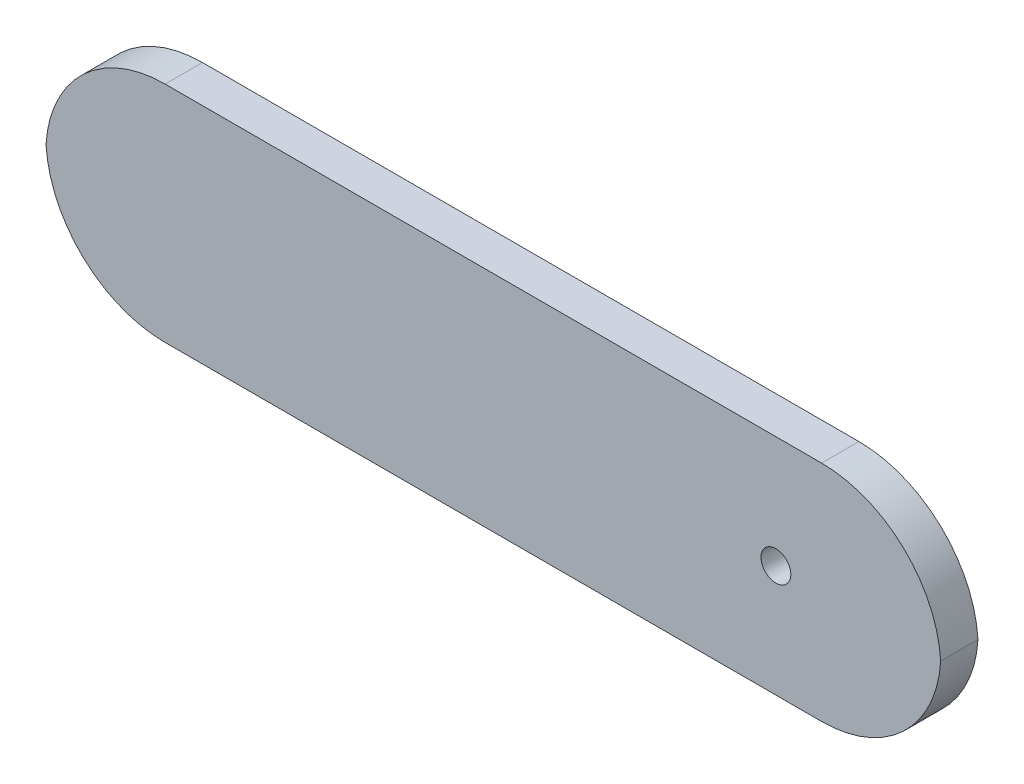
ISO-10303-21;
HEADER;
FILE_DESCRIPTION(('STEP AP214'),'2;1');
FILE_NAME('part.step','',(''),(''),'','','');
FILE_SCHEMA(('AUTOMOTIVE_DESIGN { 1 0 10303 214 1 1 1 1 }'));
ENDSEC;
DATA;
#1=APPLICATION_CONTEXT('core data for automotive mechanical design processes');
#2=APPLICATION_PROTOCOL_DEFINITION('international standard','automotive_design',2000,#1);
#3=PRODUCT_CONTEXT('',#1,'mechanical');
#4=PRODUCT('Part','Part','',(#3));
#5=PRODUCT_RELATED_PRODUCT_CATEGORY('part','',(#4));
#6=PRODUCT_DEFINITION_FORMATION('','',#4);
#7=PRODUCT_DEFINITION_CONTEXT('part definition',#1,'design');
#8=PRODUCT_DEFINITION('design','',#6,#7);
#9=PRODUCT_DEFINITION_SHAPE('','',#8);
#10=(LENGTH_UNIT() NAMED_UNIT(*) SI_UNIT(.MILLI.,.METRE.));
#11=(NAMED_UNIT(*) PLANE_ANGLE_UNIT() SI_UNIT($,.RADIAN.));
#12=(NAMED_UNIT(*) SI_UNIT($,.STERADIAN.) SOLID_ANGLE_UNIT());
#13=UNCERTAINTY_MEASURE_WITH_UNIT(LENGTH_MEASURE(1.E-05),#10,'distance_accuracy_value','');
#14=(GEOMETRIC_REPRESENTATION_CONTEXT(3) GLOBAL_UNCERTAINTY_ASSIGNED_CONTEXT((#13)) GLOBAL_UNIT_ASSIGNED_CONTEXT((#10,
#11,#12)) REPRESENTATION_CONTEXT('',''));
#15=CARTESIAN_POINT('',(0.,0.,0.));
#16=DIRECTION('',(0.,0.,1.));
#17=DIRECTION('',(1.,0.,0.));
#18=AXIS2_PLACEMENT_3D('',#15,#16,#17);
#19=CARTESIAN_POINT('',(38.1,-9.52499999999999,3.175));
#20=DIRECTION('',(0.,1.,0.));
#21=DIRECTION('',(-1.,0.,0.));
#22=AXIS2_PLACEMENT_3D('',#19,#20,#21);
#23=PLANE('',#22);
#24=DIRECTION('',(1.,0.,0.));
#25=VECTOR('',#24,1.);
#26=CARTESIAN_POINT('',(38.1,-9.52499999999999,3.175));
#27=LINE('',#26,#25);
#28=CARTESIAN_POINT('',(-27.94,-9.525,3.175));
#29=VERTEX_POINT('',#28);
#30=CARTESIAN_POINT('',(27.94,-9.52499999999999,3.175));
#31=VERTEX_POINT('',#30);
#32=EDGE_CURVE('E114',#29,#31,#27,.T.);
#33=ORIENTED_EDGE('',*,*,#32,.F.);
#34=DIRECTION('',(0.,0.,-1.));
#35=VECTOR('',#34,1.);
#36=CARTESIAN_POINT('',(-27.94,-9.525,3.175));
#37=LINE('',#36,#35);
#38=CARTESIAN_POINT('',(-27.94,-9.525,0.));
#39=VERTEX_POINT('',#38);
#40=EDGE_CURVE('E100',#29,#39,#37,.T.);
#41=ORIENTED_EDGE('',*,*,#40,.T.);
#42=DIRECTION('',(1.,0.,0.));
#43=VECTOR('',#42,1.);
#44=CARTESIAN_POINT('',(38.1,-9.52499999999999,0.));
#45=LINE('',#44,#43);
#46=CARTESIAN_POINT('',(27.94,-9.52499999999999,0.));
#47=VERTEX_POINT('',#46);
#48=EDGE_CURVE('E112',#39,#47,#45,.T.);
#49=ORIENTED_EDGE('',*,*,#48,.T.);
#50=DIRECTION('',(0.,0.,-1.));
#51=VECTOR('',#50,1.);
#52=CARTESIAN_POINT('',(27.94,-9.52499999999999,3.175));
#53=LINE('',#52,#51);
#54=EDGE_CURVE('E116',#47,#31,#53,.F.);
#55=ORIENTED_EDGE('',*,*,#54,.T.);
#56=EDGE_LOOP('',(#33,#41,#49,#55));
#57=FACE_BOUND('',#56,.T.);
#58=ADVANCED_FACE('F42',(#57),#23,.F.);
#59=CARTESIAN_POINT('',(38.1,9.52500000000001,3.175));
#60=DIRECTION('',(0.,-1.,0.));
#61=DIRECTION('',(1.,0.,0.));
#62=AXIS2_PLACEMENT_3D('',#59,#60,#61);
#63=PLANE('',#62);
#64=DIRECTION('',(-1.,0.,0.));
#65=VECTOR('',#64,1.);
#66=CARTESIAN_POINT('',(38.1,9.52500000000001,0.));
#67=LINE('',#66,#65);
#68=CARTESIAN_POINT('',(27.94,9.52500000000001,0.));
#69=VERTEX_POINT('',#68);
#70=CARTESIAN_POINT('',(-27.94,9.525,0.));
#71=VERTEX_POINT('',#70);
#72=EDGE_CURVE('E121',#69,#71,#67,.T.);
#73=ORIENTED_EDGE('',*,*,#72,.T.);
#74=DIRECTION('',(0.,0.,-1.));
#75=VECTOR('',#74,1.);
#76=CARTESIAN_POINT('',(-27.94,9.525,3.175));
#77=LINE('',#76,#75);
#78=CARTESIAN_POINT('',(-27.94,9.525,3.175));
#79=VERTEX_POINT('',#78);
#80=EDGE_CURVE('E11',#71,#79,#77,.F.);
#81=ORIENTED_EDGE('',*,*,#80,.T.);
#82=DIRECTION('',(-1.,0.,0.));
#83=VECTOR('',#82,1.);
#84=CARTESIAN_POINT('',(38.1,9.52500000000001,3.175));
#85=LINE('',#84,#83);
#86=CARTESIAN_POINT('',(27.94,9.52500000000001,3.175));
#87=VERTEX_POINT('',#86);
#88=EDGE_CURVE('E130',#87,#79,#85,.T.);
#89=ORIENTED_EDGE('',*,*,#88,.F.);
#90=DIRECTION('',(0.,0.,-1.));
#91=VECTOR('',#90,1.);
#92=CARTESIAN_POINT('',(27.94,9.52500000000001,3.175));
#93=LINE('',#92,#91);
#94=EDGE_CURVE('E51',#87,#69,#93,.T.);
#95=ORIENTED_EDGE('',*,*,#94,.T.);
#96=EDGE_LOOP('',(#73,#81,#89,#95));
#97=FACE_BOUND('',#96,.T.);
#98=ADVANCED_FACE('F154',(#97),#63,.F.);
#99=CARTESIAN_POINT('',(0.,0.,3.175));
#100=DIRECTION('',(0.,0.,1.));
#101=DIRECTION('',(1.,0.,0.));
#102=AXIS2_PLACEMENT_3D('',#99,#100,#101);
#103=PLANE('',#102);
#104=CARTESIAN_POINT('',(24.0512904816702,0.,3.175));
#105=DIRECTION('',(0.,0.,1.));
#106=DIRECTION('',(1.,0.,0.));
#107=AXIS2_PLACEMENT_3D('',#104,#105,#106);
#108=CIRCLE('',#107,1.27);
#109=CARTESIAN_POINT('',(25.3212904816702,0.,3.175));
#110=VERTEX_POINT('',#109);
#111=EDGE_CURVE('E127',#110,#110,#108,.T.);
#112=ORIENTED_EDGE('',*,*,#111,.F.);
#113=EDGE_LOOP('',(#112));
#114=FACE_BOUND('',#113,.T.);
#115=CARTESIAN_POINT('',(-27.94,-0.635,3.175));
#116=DIRECTION('',(0.,0.,1.));
#117=DIRECTION('',(1.,0.,0.));
#118=AXIS2_PLACEMENT_3D('',#115,#116,#117);
#119=CIRCLE('',#118,10.16);
#120=CARTESIAN_POINT('',(-38.0801368333963,0.,3.175));
#121=VERTEX_POINT('',#120);
#122=EDGE_CURVE('E59',#79,#121,#119,.T.);
#123=ORIENTED_EDGE('',*,*,#122,.T.);
#124=CARTESIAN_POINT('',(-27.94,0.635,3.175));
#125=DIRECTION('',(0.,0.,1.));
#126=DIRECTION('',(1.,0.,0.));
#127=AXIS2_PLACEMENT_3D('',#124,#125,#126);
#128=CIRCLE('',#127,10.16);
#129=EDGE_CURVE('E140',#121,#29,#128,.T.);
#130=ORIENTED_EDGE('',*,*,#129,.T.);
#131=ORIENTED_EDGE('',*,*,#32,.T.);
#132=CARTESIAN_POINT('',(27.94,0.635000000000007,3.175));
#133=DIRECTION('',(0.,0.,1.));
#134=DIRECTION('',(1.,0.,0.));
#135=AXIS2_PLACEMENT_3D('',#132,#133,#134);
#136=CIRCLE('',#135,10.16);
#137=CARTESIAN_POINT('',(38.0801368333963,0.,3.175));
#138=VERTEX_POINT('',#137);
#139=EDGE_CURVE('E66',#31,#138,#136,.T.);
#140=ORIENTED_EDGE('',*,*,#139,.T.);
#141=CARTESIAN_POINT('',(27.94,-0.634999999999993,3.175));
#142=DIRECTION('',(0.,0.,1.));
#143=DIRECTION('',(1.,0.,0.));
#144=AXIS2_PLACEMENT_3D('',#141,#142,#143);
#145=CIRCLE('',#144,10.16);
#146=EDGE_CURVE('E105',#138,#87,#145,.T.);
#147=ORIENTED_EDGE('',*,*,#146,.T.);
#148=ORIENTED_EDGE('',*,*,#88,.T.);
#149=EDGE_LOOP('',(#123,#130,#131,#140,#147,#148));
#150=FACE_BOUND('',#149,.T.);
#151=ADVANCED_FACE('F152',(#114,#150),#103,.T.);
#152=CARTESIAN_POINT('',(0.,0.,0.));
#153=DIRECTION('',(0.,0.,1.));
#154=DIRECTION('',(1.,0.,0.));
#155=AXIS2_PLACEMENT_3D('',#152,#153,#154);
#156=PLANE('',#155);
#157=CARTESIAN_POINT('',(24.0512904816702,0.,0.));
#158=DIRECTION('',(0.,0.,1.));
#159=DIRECTION('',(1.,0.,0.));
#160=AXIS2_PLACEMENT_3D('',#157,#158,#159);
#161=CIRCLE('',#160,1.27);
#162=CARTESIAN_POINT('',(25.3212904816702,0.,0.));
#163=VERTEX_POINT('',#162);
#164=EDGE_CURVE('E122',#163,#163,#161,.T.);
#165=ORIENTED_EDGE('',*,*,#164,.T.);
#166=EDGE_LOOP('',(#165));
#167=FACE_BOUND('',#166,.T.);
#168=ORIENTED_EDGE('',*,*,#48,.F.);
#169=CARTESIAN_POINT('',(-27.94,0.635,0.));
#170=DIRECTION('',(0.,0.,1.));
#171=DIRECTION('',(1.,0.,0.));
#172=AXIS2_PLACEMENT_3D('',#169,#170,#171);
#173=CIRCLE('',#172,10.16);
#174=CARTESIAN_POINT('',(-38.0801368333963,0.,0.));
#175=VERTEX_POINT('',#174);
#176=EDGE_CURVE('E96',#39,#175,#173,.F.);
#177=ORIENTED_EDGE('',*,*,#176,.T.);
#178=CARTESIAN_POINT('',(-27.94,-0.635,0.));
#179=DIRECTION('',(0.,0.,1.));
#180=DIRECTION('',(1.,0.,0.));
#181=AXIS2_PLACEMENT_3D('',#178,#179,#180);
#182=CIRCLE('',#181,10.16);
#183=EDGE_CURVE('E106',#175,#71,#182,.F.);
#184=ORIENTED_EDGE('',*,*,#183,.T.);
#185=ORIENTED_EDGE('',*,*,#72,.F.);
#186=CARTESIAN_POINT('',(27.94,-0.634999999999993,0.));
#187=DIRECTION('',(0.,0.,1.));
#188=DIRECTION('',(1.,0.,0.));
#189=AXIS2_PLACEMENT_3D('',#186,#187,#188);
#190=CIRCLE('',#189,10.16);
#191=CARTESIAN_POINT('',(38.0801368333963,0.,0.));
#192=VERTEX_POINT('',#191);
#193=EDGE_CURVE('E115',#69,#192,#190,.F.);
#194=ORIENTED_EDGE('',*,*,#193,.T.);
#195=CARTESIAN_POINT('',(27.94,0.635000000000007,0.));
#196=DIRECTION('',(0.,0.,1.));
#197=DIRECTION('',(1.,0.,0.));
#198=AXIS2_PLACEMENT_3D('',#195,#196,#197);
#199=CIRCLE('',#198,10.16);
#200=EDGE_CURVE('E120',#192,#47,#199,.F.);
#201=ORIENTED_EDGE('',*,*,#200,.T.);
#202=EDGE_LOOP('',(#168,#177,#184,#185,#194,#201));
#203=FACE_BOUND('',#202,.T.);
#204=ADVANCED_FACE('F118',(#167,#203),#156,.F.);
#205=CARTESIAN_POINT('',(24.0512904816702,0.,0.));
#206=DIRECTION('',(0.,0.,1.));
#207=DIRECTION('',(1.,0.,0.));
#208=AXIS2_PLACEMENT_3D('',#205,#206,#207);
#209=CYLINDRICAL_SURFACE('',#208,1.27);
#210=ORIENTED_EDGE('',*,*,#164,.F.);
#211=EDGE_LOOP('',(#210));
#212=FACE_BOUND('',#211,.T.);
#213=ORIENTED_EDGE('',*,*,#111,.T.);
#214=EDGE_LOOP('',(#213));
#215=FACE_BOUND('',#214,.T.);
#216=ADVANCED_FACE('F160',(#212,#215),#209,.F.);
#217=CARTESIAN_POINT('',(-27.94,-0.635,3.175));
#218=DIRECTION('',(0.,0.,-1.));
#219=DIRECTION('',(-1.,0.,0.));
#220=AXIS2_PLACEMENT_3D('',#217,#218,#219);
#221=CYLINDRICAL_SURFACE('',#220,10.16);
#222=DIRECTION('',(0.,0.,-1.));
#223=VECTOR('',#222,1.);
#224=CARTESIAN_POINT('',(-38.0801368333963,0.,1.5875));
#225=LINE('',#224,#223);
#226=EDGE_CURVE('E101',#121,#175,#225,.T.);
#227=ORIENTED_EDGE('',*,*,#226,.F.);
#228=ORIENTED_EDGE('',*,*,#122,.F.);
#229=ORIENTED_EDGE('',*,*,#80,.F.);
#230=ORIENTED_EDGE('',*,*,#183,.F.);
#231=EDGE_LOOP('',(#227,#228,#229,#230));
#232=FACE_BOUND('',#231,.T.);
#233=ADVANCED_FACE('F158',(#232),#221,.T.);
#234=CARTESIAN_POINT('',(-27.94,0.635,3.175));
#235=DIRECTION('',(0.,0.,-1.));
#236=DIRECTION('',(-1.,0.,0.));
#237=AXIS2_PLACEMENT_3D('',#234,#235,#236);
#238=CYLINDRICAL_SURFACE('',#237,10.16);
#239=ORIENTED_EDGE('',*,*,#129,.F.);
#240=ORIENTED_EDGE('',*,*,#226,.T.);
#241=ORIENTED_EDGE('',*,*,#176,.F.);
#242=ORIENTED_EDGE('',*,*,#40,.F.);
#243=EDGE_LOOP('',(#239,#240,#241,#242));
#244=FACE_BOUND('',#243,.T.);
#245=ADVANCED_FACE('F99',(#244),#238,.T.);
#246=CARTESIAN_POINT('',(27.94,-0.634999999999993,3.175));
#247=DIRECTION('',(0.,0.,-1.));
#248=DIRECTION('',(-1.,0.,0.));
#249=AXIS2_PLACEMENT_3D('',#246,#247,#248);
#250=CYLINDRICAL_SURFACE('',#249,10.16);
#251=ORIENTED_EDGE('',*,*,#94,.F.);
#252=ORIENTED_EDGE('',*,*,#146,.F.);
#253=DIRECTION('',(0.,0.,-1.));
#254=VECTOR('',#253,1.);
#255=CARTESIAN_POINT('',(38.0801368333963,0.,1.5875));
#256=LINE('',#255,#254);
#257=EDGE_CURVE('E46',#192,#138,#256,.F.);
#258=ORIENTED_EDGE('',*,*,#257,.F.);
#259=ORIENTED_EDGE('',*,*,#193,.F.);
#260=EDGE_LOOP('',(#251,#252,#258,#259));
#261=FACE_BOUND('',#260,.T.);
#262=ADVANCED_FACE('F44',(#261),#250,.T.);
#263=CARTESIAN_POINT('',(27.94,0.635000000000007,3.175));
#264=DIRECTION('',(0.,0.,-1.));
#265=DIRECTION('',(-1.,0.,0.));
#266=AXIS2_PLACEMENT_3D('',#263,#264,#265);
#267=CYLINDRICAL_SURFACE('',#266,10.16);
#268=ORIENTED_EDGE('',*,*,#139,.F.);
#269=ORIENTED_EDGE('',*,*,#54,.F.);
#270=ORIENTED_EDGE('',*,*,#200,.F.);
#271=ORIENTED_EDGE('',*,*,#257,.T.);
#272=EDGE_LOOP('',(#268,#269,#270,#271));
#273=FACE_BOUND('',#272,.T.);
#274=ADVANCED_FACE('F147',(#273),#267,.T.);
#275=CLOSED_SHELL('',(#58,#98,#151,#204,#216,#233,#245,#262,#274));
#276=MANIFOLD_SOLID_BREP('B2',#275);
#277=ADVANCED_BREP_SHAPE_REPRESENTATION('',(#18,#276),#14);
#278=SHAPE_DEFINITION_REPRESENTATION(#9,#277);
ENDSEC;
END-ISO-10303-21;
